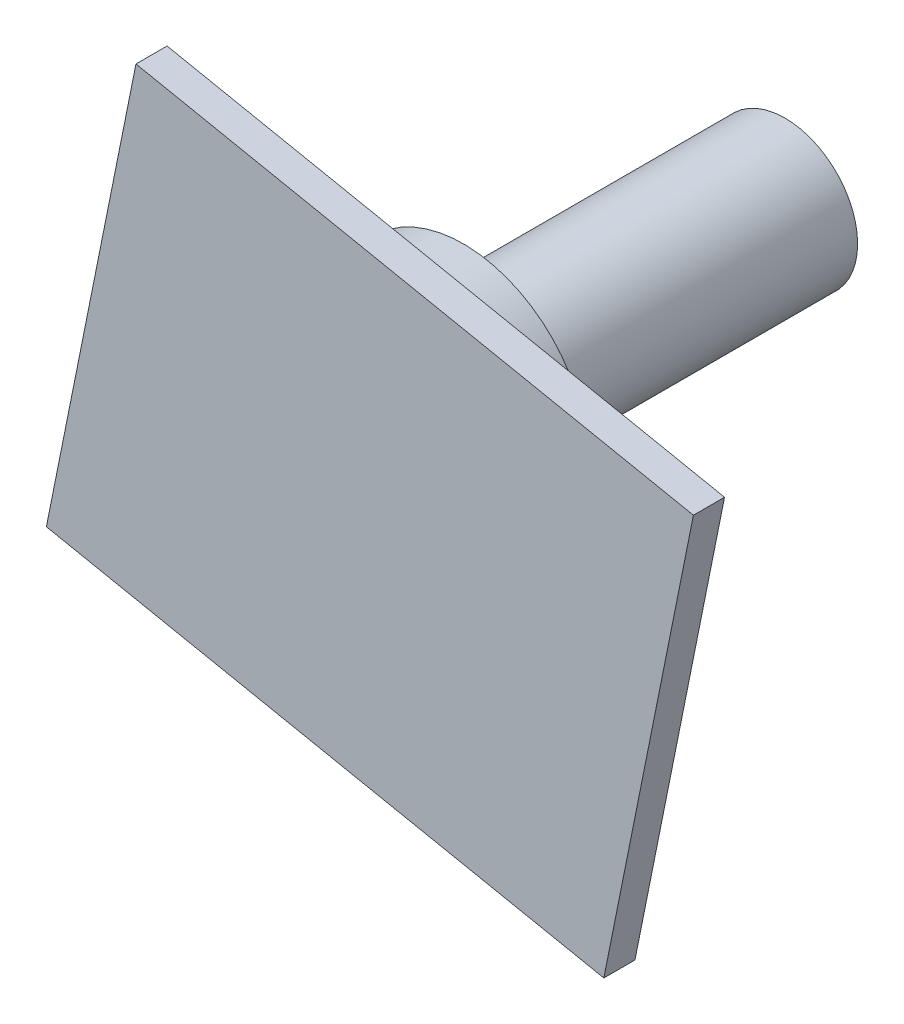
ISO-10303-21;
HEADER;
FILE_DESCRIPTION(('STEP AP214'),'2;1');
FILE_NAME('part.step','',(''),(''),'','','');
FILE_SCHEMA(('AUTOMOTIVE_DESIGN { 1 0 10303 214 1 1 1 1 }'));
ENDSEC;
DATA;
#1=APPLICATION_CONTEXT('core data for automotive mechanical design processes');
#2=APPLICATION_PROTOCOL_DEFINITION('international standard','automotive_design',2000,#1);
#3=PRODUCT_CONTEXT('',#1,'mechanical');
#4=PRODUCT('Part','Part','',(#3));
#5=PRODUCT_RELATED_PRODUCT_CATEGORY('part','',(#4));
#6=PRODUCT_DEFINITION_FORMATION('','',#4);
#7=PRODUCT_DEFINITION_CONTEXT('part definition',#1,'design');
#8=PRODUCT_DEFINITION('design','',#6,#7);
#9=PRODUCT_DEFINITION_SHAPE('','',#8);
#10=(LENGTH_UNIT() NAMED_UNIT(*) SI_UNIT(.MILLI.,.METRE.));
#11=(NAMED_UNIT(*) PLANE_ANGLE_UNIT() SI_UNIT($,.RADIAN.));
#12=(NAMED_UNIT(*) SI_UNIT($,.STERADIAN.) SOLID_ANGLE_UNIT());
#13=UNCERTAINTY_MEASURE_WITH_UNIT(LENGTH_MEASURE(1.E-05),#10,'distance_accuracy_value','');
#14=(GEOMETRIC_REPRESENTATION_CONTEXT(3) GLOBAL_UNCERTAINTY_ASSIGNED_CONTEXT((#13)) GLOBAL_UNIT_ASSIGNED_CONTEXT((#10,
#11,#12)) REPRESENTATION_CONTEXT('',''));
#15=CARTESIAN_POINT('',(0.,0.,0.));
#16=DIRECTION('',(0.,0.,1.));
#17=DIRECTION('',(1.,0.,0.));
#18=AXIS2_PLACEMENT_3D('',#15,#16,#17);
#19=CARTESIAN_POINT('',(-86.6066497970745,-63.7835303855215,34.));
#20=DIRECTION('',(0.,0.,-1.));
#21=DIRECTION('',(-1.,0.,0.));
#22=AXIS2_PLACEMENT_3D('',#19,#20,#21);
#23=CYLINDRICAL_SURFACE('',#22,7.00000000000002);
#24=CARTESIAN_POINT('',(-86.6066497970745,-63.7835303855215,0.));
#25=DIRECTION('',(0.,0.,1.));
#26=DIRECTION('',(1.,0.,0.));
#27=AXIS2_PLACEMENT_3D('',#24,#25,#26);
#28=CIRCLE('',#27,7.00000000000002);
#29=CARTESIAN_POINT('',(-79.6066497970745,-63.7835303855215,0.));
#30=VERTEX_POINT('',#29);
#31=EDGE_CURVE('E49',#30,#30,#28,.T.);
#32=ORIENTED_EDGE('',*,*,#31,.T.);
#33=EDGE_LOOP('',(#32));
#34=FACE_BOUND('',#33,.T.);
#35=CARTESIAN_POINT('',(-86.6066497970745,-63.7835303855215,31.));
#36=DIRECTION('',(0.,0.,1.));
#37=DIRECTION('',(1.,0.,0.));
#38=AXIS2_PLACEMENT_3D('',#35,#36,#37);
#39=CIRCLE('',#38,7.00000000000002);
#40=CARTESIAN_POINT('',(-79.6066497970745,-63.7835303855215,31.));
#41=VERTEX_POINT('',#40);
#42=EDGE_CURVE('E11',#41,#41,#39,.T.);
#43=ORIENTED_EDGE('',*,*,#42,.F.);
#44=EDGE_LOOP('',(#43));
#45=FACE_BOUND('',#44,.T.);
#46=ADVANCED_FACE('F41',(#34,#45),#23,.T.);
#47=CARTESIAN_POINT('',(-86.6066497970745,-63.7835303855215,0.));
#48=DIRECTION('',(0.,0.,1.));
#49=DIRECTION('',(1.,0.,0.));
#50=AXIS2_PLACEMENT_3D('',#47,#48,#49);
#51=PLANE('',#50);
#52=ORIENTED_EDGE('',*,*,#31,.F.);
#53=EDGE_LOOP('',(#52));
#54=FACE_BOUND('',#53,.T.);
#55=ADVANCED_FACE('F127',(#54),#51,.F.);
#56=CARTESIAN_POINT('',(-86.6066497970745,-63.7835303855215,36.));
#57=DIRECTION('',(0.,0.,-1.));
#58=DIRECTION('',(-1.,0.,0.));
#59=AXIS2_PLACEMENT_3D('',#56,#57,#58);
#60=CYLINDRICAL_SURFACE('',#59,12.);
#61=CARTESIAN_POINT('',(-86.6066497970745,-63.7835303855215,36.));
#62=DIRECTION('',(0.,0.,1.));
#63=DIRECTION('',(1.,0.,0.));
#64=AXIS2_PLACEMENT_3D('',#61,#62,#63);
#65=CIRCLE('',#64,12.);
#66=CARTESIAN_POINT('',(-74.6066497970745,-63.7835303855215,36.));
#67=VERTEX_POINT('',#66);
#68=EDGE_CURVE('E120',#67,#67,#65,.T.);
#69=ORIENTED_EDGE('',*,*,#68,.F.);
#70=EDGE_LOOP('',(#69));
#71=FACE_BOUND('',#70,.T.);
#72=CARTESIAN_POINT('',(-86.6066497970745,-63.7835303855215,31.));
#73=DIRECTION('',(0.,0.,1.));
#74=DIRECTION('',(1.,0.,0.));
#75=AXIS2_PLACEMENT_3D('',#72,#73,#74);
#76=CIRCLE('',#75,12.);
#77=CARTESIAN_POINT('',(-74.6066497970745,-63.7835303855215,31.));
#78=VERTEX_POINT('',#77);
#79=EDGE_CURVE('E117',#78,#78,#76,.T.);
#80=ORIENTED_EDGE('',*,*,#79,.T.);
#81=EDGE_LOOP('',(#80));
#82=FACE_BOUND('',#81,.T.);
#83=ADVANCED_FACE('F129',(#71,#82),#60,.T.);
#84=CARTESIAN_POINT('',(-86.6066497970745,-63.7835303855215,31.));
#85=DIRECTION('',(0.,0.,1.));
#86=DIRECTION('',(1.,0.,0.));
#87=AXIS2_PLACEMENT_3D('',#84,#85,#86);
#88=PLANE('',#87);
#89=ORIENTED_EDGE('',*,*,#42,.T.);
#90=EDGE_LOOP('',(#89));
#91=FACE_BOUND('',#90,.T.);
#92=ORIENTED_EDGE('',*,*,#79,.F.);
#93=EDGE_LOOP('',(#92));
#94=FACE_BOUND('',#93,.T.);
#95=ADVANCED_FACE('F134',(#91,#94),#88,.F.);
#96=CARTESIAN_POINT('',(-110.176537097125,-44.5529438997466,39.));
#97=DIRECTION('',(0.980385757120003,-0.197088221962244,0.));
#98=DIRECTION('',(0.197088221962244,0.980385757120003,0.));
#99=AXIS2_PLACEMENT_3D('',#96,#97,#98);
#100=PLANE('',#99);
#101=DIRECTION('',(-0.197088221962244,-0.980385757120003,0.));
#102=VECTOR('',#101,1.);
#103=CARTESIAN_POINT('',(-110.176537097125,-44.5529438997466,36.));
#104=LINE('',#103,#102);
#105=CARTESIAN_POINT('',(-110.176537097125,-44.5529438997466,36.));
#106=VERTEX_POINT('',#105);
#107=CARTESIAN_POINT('',(-118.811763806813,-87.5075821393774,36.));
#108=VERTEX_POINT('',#107);
#109=EDGE_CURVE('E108',#106,#108,#104,.T.);
#110=ORIENTED_EDGE('',*,*,#109,.T.);
#111=DIRECTION('',(0.,0.,-1.));
#112=VECTOR('',#111,1.);
#113=CARTESIAN_POINT('',(-118.811763806813,-87.5075821393774,39.));
#114=LINE('',#113,#112);
#115=CARTESIAN_POINT('',(-118.811763806813,-87.5075821393774,39.));
#116=VERTEX_POINT('',#115);
#117=EDGE_CURVE('E99',#116,#108,#114,.T.);
#118=ORIENTED_EDGE('',*,*,#117,.F.);
#119=DIRECTION('',(-0.197088221962244,-0.980385757120003,0.));
#120=VECTOR('',#119,1.);
#121=CARTESIAN_POINT('',(-110.176537097125,-44.5529438997466,39.));
#122=LINE('',#121,#120);
#123=CARTESIAN_POINT('',(-110.176537097125,-44.5529438997466,39.));
#124=VERTEX_POINT('',#123);
#125=EDGE_CURVE('E93',#124,#116,#122,.T.);
#126=ORIENTED_EDGE('',*,*,#125,.F.);
#127=DIRECTION('',(0.,0.,-1.));
#128=VECTOR('',#127,1.);
#129=CARTESIAN_POINT('',(-110.176537097125,-44.5529438997466,39.));
#130=LINE('',#129,#128);
#131=EDGE_CURVE('E104',#124,#106,#130,.T.);
#132=ORIENTED_EDGE('',*,*,#131,.T.);
#133=EDGE_LOOP('',(#110,#118,#126,#132));
#134=FACE_BOUND('',#133,.T.);
#135=ADVANCED_FACE('F140',(#134),#100,.F.);
#136=CARTESIAN_POINT('',(-118.811763806813,-87.5075821393774,39.));
#137=DIRECTION('',(0.197088221962244,0.980385757120003,0.));
#138=DIRECTION('',(-0.980385757120003,0.197088221962245,0.));
#139=AXIS2_PLACEMENT_3D('',#136,#137,#138);
#140=PLANE('',#139);
#141=DIRECTION('',(0.980385757120003,-0.197088221962245,0.));
#142=VECTOR('',#141,1.);
#143=CARTESIAN_POINT('',(-118.811763806813,-87.5075821393774,36.));
#144=LINE('',#143,#142);
#145=CARTESIAN_POINT('',(-65.0720875901541,-98.3109390399118,36.));
#146=VERTEX_POINT('',#145);
#147=EDGE_CURVE('E98',#108,#146,#144,.T.);
#148=ORIENTED_EDGE('',*,*,#147,.T.);
#149=DIRECTION('',(0.,0.,-1.));
#150=VECTOR('',#149,1.);
#151=CARTESIAN_POINT('',(-65.0720875901541,-98.3109390399118,39.));
#152=LINE('',#151,#150);
#153=CARTESIAN_POINT('',(-65.0720875901541,-98.3109390399118,39.));
#154=VERTEX_POINT('',#153);
#155=EDGE_CURVE('E96',#154,#146,#152,.T.);
#156=ORIENTED_EDGE('',*,*,#155,.F.);
#157=DIRECTION('',(0.980385757120003,-0.197088221962245,0.));
#158=VECTOR('',#157,1.);
#159=CARTESIAN_POINT('',(-118.811763806813,-87.5075821393774,39.));
#160=LINE('',#159,#158);
#161=EDGE_CURVE('E88',#116,#154,#160,.T.);
#162=ORIENTED_EDGE('',*,*,#161,.F.);
#163=ORIENTED_EDGE('',*,*,#117,.T.);
#164=EDGE_LOOP('',(#148,#156,#162,#163));
#165=FACE_BOUND('',#164,.T.);
#166=ADVANCED_FACE('F97',(#165),#140,.F.);
#167=CARTESIAN_POINT('',(-56.4368608804662,-55.356300800281,39.));
#168=DIRECTION('',(-0.980385757120003,0.197088221962245,0.));
#169=DIRECTION('',(-0.197088221962245,-0.980385757120003,0.));
#170=AXIS2_PLACEMENT_3D('',#167,#168,#169);
#171=PLANE('',#170);
#172=DIRECTION('',(0.197088221962245,0.980385757120003,0.));
#173=VECTOR('',#172,1.);
#174=CARTESIAN_POINT('',(-56.4368608804662,-55.356300800281,36.));
#175=LINE('',#174,#173);
#176=CARTESIAN_POINT('',(-56.4368608804662,-55.356300800281,36.));
#177=VERTEX_POINT('',#176);
#178=EDGE_CURVE('E74',#146,#177,#175,.T.);
#179=ORIENTED_EDGE('',*,*,#178,.T.);
#180=DIRECTION('',(0.,0.,-1.));
#181=VECTOR('',#180,1.);
#182=CARTESIAN_POINT('',(-56.4368608804662,-55.356300800281,39.));
#183=LINE('',#182,#181);
#184=CARTESIAN_POINT('',(-56.4368608804662,-55.356300800281,39.));
#185=VERTEX_POINT('',#184);
#186=EDGE_CURVE('E100',#185,#177,#183,.T.);
#187=ORIENTED_EDGE('',*,*,#186,.F.);
#188=DIRECTION('',(0.197088221962245,0.980385757120003,0.));
#189=VECTOR('',#188,1.);
#190=CARTESIAN_POINT('',(-56.4368608804662,-55.356300800281,39.));
#191=LINE('',#190,#189);
#192=EDGE_CURVE('E91',#154,#185,#191,.T.);
#193=ORIENTED_EDGE('',*,*,#192,.F.);
#194=ORIENTED_EDGE('',*,*,#155,.T.);
#195=EDGE_LOOP('',(#179,#187,#193,#194));
#196=FACE_BOUND('',#195,.T.);
#197=ADVANCED_FACE('F102',(#196),#171,.F.);
#198=CARTESIAN_POINT('',(-110.176537097125,-44.5529438997466,39.));
#199=DIRECTION('',(-0.197088221962244,-0.980385757120003,0.));
#200=DIRECTION('',(0.980385757120003,-0.197088221962244,0.));
#201=AXIS2_PLACEMENT_3D('',#198,#199,#200);
#202=PLANE('',#201);
#203=DIRECTION('',(-0.980385757120003,0.197088221962244,0.));
#204=VECTOR('',#203,1.);
#205=CARTESIAN_POINT('',(-110.176537097125,-44.5529438997466,36.));
#206=LINE('',#205,#204);
#207=EDGE_CURVE('E80',#177,#106,#206,.T.);
#208=ORIENTED_EDGE('',*,*,#207,.T.);
#209=ORIENTED_EDGE('',*,*,#131,.F.);
#210=DIRECTION('',(-0.980385757120003,0.197088221962244,0.));
#211=VECTOR('',#210,1.);
#212=CARTESIAN_POINT('',(-110.176537097125,-44.5529438997466,39.));
#213=LINE('',#212,#211);
#214=EDGE_CURVE('E57',#185,#124,#213,.T.);
#215=ORIENTED_EDGE('',*,*,#214,.F.);
#216=ORIENTED_EDGE('',*,*,#186,.T.);
#217=EDGE_LOOP('',(#208,#209,#215,#216));
#218=FACE_BOUND('',#217,.T.);
#219=ADVANCED_FACE('F149',(#218),#202,.F.);
#220=CARTESIAN_POINT('',(0.,0.,39.));
#221=DIRECTION('',(0.,0.,1.));
#222=DIRECTION('',(1.,0.,0.));
#223=AXIS2_PLACEMENT_3D('',#220,#221,#222);
#224=PLANE('',#223);
#225=ORIENTED_EDGE('',*,*,#125,.T.);
#226=ORIENTED_EDGE('',*,*,#161,.T.);
#227=ORIENTED_EDGE('',*,*,#192,.T.);
#228=ORIENTED_EDGE('',*,*,#214,.T.);
#229=EDGE_LOOP('',(#225,#226,#227,#228));
#230=FACE_BOUND('',#229,.T.);
#231=ADVANCED_FACE('F89',(#230),#224,.T.);
#232=CARTESIAN_POINT('',(0.,0.,36.));
#233=DIRECTION('',(0.,0.,1.));
#234=DIRECTION('',(1.,0.,0.));
#235=AXIS2_PLACEMENT_3D('',#232,#233,#234);
#236=PLANE('',#235);
#237=ORIENTED_EDGE('',*,*,#68,.T.);
#238=EDGE_LOOP('',(#237));
#239=FACE_BOUND('',#238,.T.);
#240=ORIENTED_EDGE('',*,*,#109,.F.);
#241=ORIENTED_EDGE('',*,*,#207,.F.);
#242=ORIENTED_EDGE('',*,*,#178,.F.);
#243=ORIENTED_EDGE('',*,*,#147,.F.);
#244=EDGE_LOOP('',(#240,#241,#242,#243));
#245=FACE_BOUND('',#244,.T.);
#246=ADVANCED_FACE('F152',(#239,#245),#236,.F.);
#247=CLOSED_SHELL('',(#46,#55,#83,#95,#135,#166,#197,#219,#231,#246));
#248=MANIFOLD_SOLID_BREP('B2',#247);
#249=ADVANCED_BREP_SHAPE_REPRESENTATION('',(#18,#248),#14);
#250=SHAPE_DEFINITION_REPRESENTATION(#9,#249);
ENDSEC;
END-ISO-10303-21;
